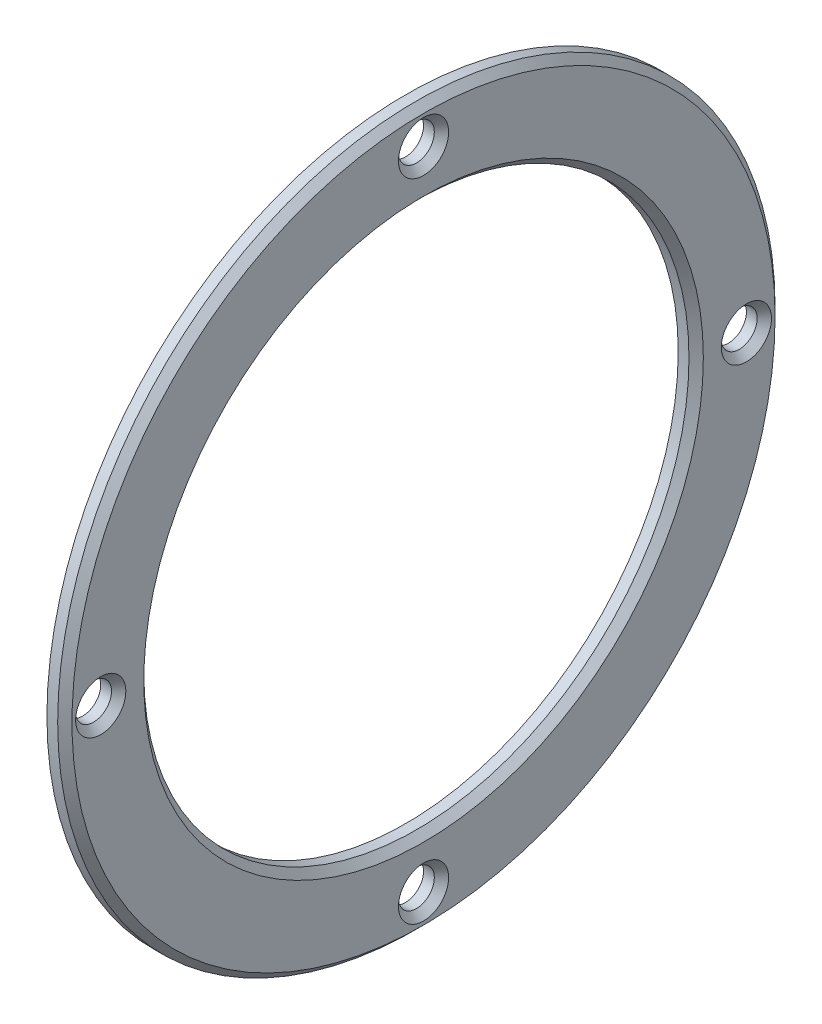
ISO-10303-21;
HEADER;
FILE_DESCRIPTION(('STEP AP214'),'2;1');
FILE_NAME('part.step','',(''),(''),'','','');
FILE_SCHEMA(('AUTOMOTIVE_DESIGN { 1 0 10303 214 1 1 1 1 }'));
ENDSEC;
DATA;
#1=APPLICATION_CONTEXT('core data for automotive mechanical design processes');
#2=APPLICATION_PROTOCOL_DEFINITION('international standard','automotive_design',2000,#1);
#3=PRODUCT_CONTEXT('',#1,'mechanical');
#4=PRODUCT('Part','Part','',(#3));
#5=PRODUCT_RELATED_PRODUCT_CATEGORY('part','',(#4));
#6=PRODUCT_DEFINITION_FORMATION('','',#4);
#7=PRODUCT_DEFINITION_CONTEXT('part definition',#1,'design');
#8=PRODUCT_DEFINITION('design','',#6,#7);
#9=PRODUCT_DEFINITION_SHAPE('','',#8);
#10=(LENGTH_UNIT() NAMED_UNIT(*) SI_UNIT(.MILLI.,.METRE.));
#11=(NAMED_UNIT(*) PLANE_ANGLE_UNIT() SI_UNIT($,.RADIAN.));
#12=(NAMED_UNIT(*) SI_UNIT($,.STERADIAN.) SOLID_ANGLE_UNIT());
#13=UNCERTAINTY_MEASURE_WITH_UNIT(LENGTH_MEASURE(1.E-05),#10,'distance_accuracy_value','');
#14=(GEOMETRIC_REPRESENTATION_CONTEXT(3) GLOBAL_UNCERTAINTY_ASSIGNED_CONTEXT((#13)) GLOBAL_UNIT_ASSIGNED_CONTEXT((#10,
#11,#12)) REPRESENTATION_CONTEXT('',''));
#15=CARTESIAN_POINT('',(0.,0.,0.));
#16=DIRECTION('',(0.,0.,1.));
#17=DIRECTION('',(1.,0.,0.));
#18=AXIS2_PLACEMENT_3D('',#15,#16,#17);
#19=CARTESIAN_POINT('',(2.5,0.,0.));
#20=DIRECTION('',(1.,0.,0.));
#21=DIRECTION('',(0.,0.,-1.));
#22=AXIS2_PLACEMENT_3D('',#19,#20,#21);
#23=PLANE('',#22);
#24=CARTESIAN_POINT('',(2.5,0.,45.));
#25=DIRECTION('',(1.,0.,0.));
#26=DIRECTION('',(0.,0.,-1.));
#27=AXIS2_PLACEMENT_3D('',#24,#25,#26);
#28=CIRCLE('',#27,3.50000000000002);
#29=CARTESIAN_POINT('',(2.5,0.,41.5));
#30=VERTEX_POINT('',#29);
#31=EDGE_CURVE('E74',#30,#30,#28,.F.);
#32=ORIENTED_EDGE('',*,*,#31,.T.);
#33=EDGE_LOOP('',(#32));
#34=FACE_BOUND('',#33,.T.);
#35=CARTESIAN_POINT('',(2.5,0.,-45.));
#36=DIRECTION('',(1.,0.,0.));
#37=DIRECTION('',(0.,0.,-1.));
#38=AXIS2_PLACEMENT_3D('',#35,#36,#37);
#39=CIRCLE('',#38,3.50000000000002);
#40=CARTESIAN_POINT('',(2.5,0.,-48.5));
#41=VERTEX_POINT('',#40);
#42=EDGE_CURVE('E78',#41,#41,#39,.F.);
#43=ORIENTED_EDGE('',*,*,#42,.T.);
#44=EDGE_LOOP('',(#43));
#45=FACE_BOUND('',#44,.T.);
#46=CARTESIAN_POINT('',(2.5,0.,0.));
#47=DIRECTION('',(1.,0.,0.));
#48=DIRECTION('',(0.,0.,-1.));
#49=AXIS2_PLACEMENT_3D('',#46,#47,#48);
#50=CIRCLE('',#49,39.);
#51=CARTESIAN_POINT('',(2.5,0.,-39.));
#52=VERTEX_POINT('',#51);
#53=EDGE_CURVE('E82',#52,#52,#50,.F.);
#54=ORIENTED_EDGE('',*,*,#53,.T.);
#55=EDGE_LOOP('',(#54));
#56=FACE_BOUND('',#55,.T.);
#57=CARTESIAN_POINT('',(2.5,0.,0.));
#58=DIRECTION('',(1.,0.,0.));
#59=DIRECTION('',(0.,0.,-1.));
#60=AXIS2_PLACEMENT_3D('',#57,#58,#59);
#61=CIRCLE('',#60,49.);
#62=CARTESIAN_POINT('',(2.5,0.,-49.));
#63=VERTEX_POINT('',#62);
#64=EDGE_CURVE('E86',#63,#63,#61,.T.);
#65=ORIENTED_EDGE('',*,*,#64,.T.);
#66=EDGE_LOOP('',(#65));
#67=FACE_BOUND('',#66,.T.);
#68=CARTESIAN_POINT('',(2.5,45.,0.));
#69=DIRECTION('',(1.,0.,0.));
#70=DIRECTION('',(0.,0.,-1.));
#71=AXIS2_PLACEMENT_3D('',#68,#69,#70);
#72=CIRCLE('',#71,3.50000000000002);
#73=CARTESIAN_POINT('',(2.5,45.,-3.50000000000002));
#74=VERTEX_POINT('',#73);
#75=EDGE_CURVE('E90',#74,#74,#72,.F.);
#76=ORIENTED_EDGE('',*,*,#75,.T.);
#77=EDGE_LOOP('',(#76));
#78=FACE_BOUND('',#77,.T.);
#79=CARTESIAN_POINT('',(2.5,-45.,0.));
#80=DIRECTION('',(1.,0.,0.));
#81=DIRECTION('',(0.,0.,-1.));
#82=AXIS2_PLACEMENT_3D('',#79,#80,#81);
#83=CIRCLE('',#82,3.50000000000002);
#84=CARTESIAN_POINT('',(2.5,-45.,-3.50000000000002));
#85=VERTEX_POINT('',#84);
#86=EDGE_CURVE('E94',#85,#85,#83,.F.);
#87=ORIENTED_EDGE('',*,*,#86,.T.);
#88=EDGE_LOOP('',(#87));
#89=FACE_BOUND('',#88,.T.);
#90=ADVANCED_FACE('F45',(#34,#45,#56,#67,#78,#89),#23,.T.);
#91=CARTESIAN_POINT('',(0.,0.,0.));
#92=DIRECTION('',(1.,0.,0.));
#93=DIRECTION('',(0.,0.,-1.));
#94=AXIS2_PLACEMENT_3D('',#91,#92,#93);
#95=PLANE('',#94);
#96=CARTESIAN_POINT('',(0.,0.,0.));
#97=DIRECTION('',(1.,0.,0.));
#98=DIRECTION('',(0.,0.,-1.));
#99=AXIS2_PLACEMENT_3D('',#96,#97,#98);
#100=CIRCLE('',#99,50.);
#101=CARTESIAN_POINT('',(0.,0.,-50.));
#102=VERTEX_POINT('',#101);
#103=EDGE_CURVE('E102',#102,#102,#100,.T.);
#104=ORIENTED_EDGE('',*,*,#103,.F.);
#105=EDGE_LOOP('',(#104));
#106=FACE_BOUND('',#105,.T.);
#107=CARTESIAN_POINT('',(0.,0.,0.));
#108=DIRECTION('',(1.,0.,0.));
#109=DIRECTION('',(0.,0.,-1.));
#110=AXIS2_PLACEMENT_3D('',#107,#108,#109);
#111=CIRCLE('',#110,38.);
#112=CARTESIAN_POINT('',(0.,0.,-38.));
#113=VERTEX_POINT('',#112);
#114=EDGE_CURVE('E106',#113,#113,#111,.T.);
#115=ORIENTED_EDGE('',*,*,#114,.T.);
#116=EDGE_LOOP('',(#115));
#117=FACE_BOUND('',#116,.T.);
#118=CARTESIAN_POINT('',(0.,45.,0.));
#119=DIRECTION('',(1.,0.,0.));
#120=DIRECTION('',(0.,0.,-1.));
#121=AXIS2_PLACEMENT_3D('',#118,#119,#120);
#122=CIRCLE('',#121,2.5);
#123=CARTESIAN_POINT('',(0.,45.,-2.5));
#124=VERTEX_POINT('',#123);
#125=EDGE_CURVE('E110',#124,#124,#122,.T.);
#126=ORIENTED_EDGE('',*,*,#125,.T.);
#127=EDGE_LOOP('',(#126));
#128=FACE_BOUND('',#127,.T.);
#129=CARTESIAN_POINT('',(0.,0.,-45.));
#130=DIRECTION('',(1.,0.,0.));
#131=DIRECTION('',(0.,0.,-1.));
#132=AXIS2_PLACEMENT_3D('',#129,#130,#131);
#133=CIRCLE('',#132,2.5);
#134=CARTESIAN_POINT('',(0.,0.,-47.5));
#135=VERTEX_POINT('',#134);
#136=EDGE_CURVE('E114',#135,#135,#133,.T.);
#137=ORIENTED_EDGE('',*,*,#136,.T.);
#138=EDGE_LOOP('',(#137));
#139=FACE_BOUND('',#138,.T.);
#140=CARTESIAN_POINT('',(0.,-45.,0.));
#141=DIRECTION('',(1.,0.,0.));
#142=DIRECTION('',(0.,0.,-1.));
#143=AXIS2_PLACEMENT_3D('',#140,#141,#142);
#144=CIRCLE('',#143,2.5);
#145=CARTESIAN_POINT('',(0.,-45.,-2.50000000000001));
#146=VERTEX_POINT('',#145);
#147=EDGE_CURVE('E118',#146,#146,#144,.T.);
#148=ORIENTED_EDGE('',*,*,#147,.T.);
#149=EDGE_LOOP('',(#148));
#150=FACE_BOUND('',#149,.T.);
#151=CARTESIAN_POINT('',(0.,0.,45.));
#152=DIRECTION('',(1.,0.,0.));
#153=DIRECTION('',(0.,0.,-1.));
#154=AXIS2_PLACEMENT_3D('',#151,#152,#153);
#155=CIRCLE('',#154,2.5);
#156=CARTESIAN_POINT('',(0.,0.,42.5));
#157=VERTEX_POINT('',#156);
#158=EDGE_CURVE('E122',#157,#157,#155,.T.);
#159=ORIENTED_EDGE('',*,*,#158,.T.);
#160=EDGE_LOOP('',(#159));
#161=FACE_BOUND('',#160,.T.);
#162=ADVANCED_FACE('F127',(#106,#117,#128,#139,#150,#161),#95,.F.);
#163=CARTESIAN_POINT('',(2.5,0.,0.));
#164=DIRECTION('',(-1.,0.,0.));
#165=DIRECTION('',(0.,0.,1.));
#166=AXIS2_PLACEMENT_3D('',#163,#164,#165);
#167=CYLINDRICAL_SURFACE('',#166,50.);
#168=CARTESIAN_POINT('',(1.50000000000001,0.,0.));
#169=DIRECTION('',(1.,0.,0.));
#170=DIRECTION('',(0.,0.,-1.));
#171=AXIS2_PLACEMENT_3D('',#168,#169,#170);
#172=CIRCLE('',#171,50.);
#173=CARTESIAN_POINT('',(1.50000000000001,0.,-50.));
#174=VERTEX_POINT('',#173);
#175=EDGE_CURVE('E59',#174,#174,#172,.F.);
#176=ORIENTED_EDGE('',*,*,#175,.T.);
#177=EDGE_LOOP('',(#176));
#178=FACE_BOUND('',#177,.T.);
#179=ORIENTED_EDGE('',*,*,#103,.T.);
#180=EDGE_LOOP('',(#179));
#181=FACE_BOUND('',#180,.T.);
#182=ADVANCED_FACE('F151',(#178,#181),#167,.T.);
#183=CARTESIAN_POINT('',(2.5,0.,0.));
#184=DIRECTION('',(-1.,0.,0.));
#185=DIRECTION('',(0.,0.,1.));
#186=AXIS2_PLACEMENT_3D('',#183,#184,#185);
#187=CYLINDRICAL_SURFACE('',#186,38.);
#188=CARTESIAN_POINT('',(1.49999999999999,0.,0.));
#189=DIRECTION('',(1.,0.,0.));
#190=DIRECTION('',(0.,0.,-1.));
#191=AXIS2_PLACEMENT_3D('',#188,#189,#190);
#192=CIRCLE('',#191,38.);
#193=CARTESIAN_POINT('',(1.49999999999999,0.,-38.));
#194=VERTEX_POINT('',#193);
#195=EDGE_CURVE('E64',#194,#194,#192,.T.);
#196=ORIENTED_EDGE('',*,*,#195,.T.);
#197=EDGE_LOOP('',(#196));
#198=FACE_BOUND('',#197,.T.);
#199=ORIENTED_EDGE('',*,*,#114,.F.);
#200=EDGE_LOOP('',(#199));
#201=FACE_BOUND('',#200,.T.);
#202=ADVANCED_FACE('F156',(#198,#201),#187,.F.);
#203=CARTESIAN_POINT('',(2.5,45.,0.));
#204=DIRECTION('',(-1.,0.,0.));
#205=DIRECTION('',(0.,0.,1.));
#206=AXIS2_PLACEMENT_3D('',#203,#204,#205);
#207=CYLINDRICAL_SURFACE('',#206,2.5);
#208=CARTESIAN_POINT('',(1.49999999999999,45.,0.));
#209=DIRECTION('',(1.,0.,0.));
#210=DIRECTION('',(0.,0.,-1.));
#211=AXIS2_PLACEMENT_3D('',#208,#209,#210);
#212=CIRCLE('',#211,2.5);
#213=CARTESIAN_POINT('',(1.49999999999999,45.,-2.5));
#214=VERTEX_POINT('',#213);
#215=EDGE_CURVE('E54',#214,#214,#212,.T.);
#216=ORIENTED_EDGE('',*,*,#215,.T.);
#217=EDGE_LOOP('',(#216));
#218=FACE_BOUND('',#217,.T.);
#219=ORIENTED_EDGE('',*,*,#125,.F.);
#220=EDGE_LOOP('',(#219));
#221=FACE_BOUND('',#220,.T.);
#222=ADVANCED_FACE('F249',(#218,#221),#207,.F.);
#223=CARTESIAN_POINT('',(2.5,0.,-45.));
#224=DIRECTION('',(-1.,0.,0.));
#225=DIRECTION('',(0.,0.,1.));
#226=AXIS2_PLACEMENT_3D('',#223,#224,#225);
#227=CYLINDRICAL_SURFACE('',#226,2.5);
#228=CARTESIAN_POINT('',(1.49999999999999,0.,-45.));
#229=DIRECTION('',(1.,0.,0.));
#230=DIRECTION('',(0.,0.,-1.));
#231=AXIS2_PLACEMENT_3D('',#228,#229,#230);
#232=CIRCLE('',#231,2.5);
#233=CARTESIAN_POINT('',(1.49999999999999,0.,-47.5));
#234=VERTEX_POINT('',#233);
#235=EDGE_CURVE('E70',#234,#234,#232,.T.);
#236=ORIENTED_EDGE('',*,*,#235,.T.);
#237=EDGE_LOOP('',(#236));
#238=FACE_BOUND('',#237,.T.);
#239=ORIENTED_EDGE('',*,*,#136,.F.);
#240=EDGE_LOOP('',(#239));
#241=FACE_BOUND('',#240,.T.);
#242=ADVANCED_FACE('F142',(#238,#241),#227,.F.);
#243=CARTESIAN_POINT('',(2.5,-45.,0.));
#244=DIRECTION('',(-1.,0.,0.));
#245=DIRECTION('',(0.,0.,1.));
#246=AXIS2_PLACEMENT_3D('',#243,#244,#245);
#247=CYLINDRICAL_SURFACE('',#246,2.5);
#248=CARTESIAN_POINT('',(1.49999999999999,-45.,0.));
#249=DIRECTION('',(1.,0.,0.));
#250=DIRECTION('',(0.,0.,-1.));
#251=AXIS2_PLACEMENT_3D('',#248,#249,#250);
#252=CIRCLE('',#251,2.5);
#253=CARTESIAN_POINT('',(1.49999999999999,-45.,-2.50000000000001));
#254=VERTEX_POINT('',#253);
#255=EDGE_CURVE('E10',#254,#254,#252,.T.);
#256=ORIENTED_EDGE('',*,*,#255,.T.);
#257=EDGE_LOOP('',(#256));
#258=FACE_BOUND('',#257,.T.);
#259=ORIENTED_EDGE('',*,*,#147,.F.);
#260=EDGE_LOOP('',(#259));
#261=FACE_BOUND('',#260,.T.);
#262=ADVANCED_FACE('F132',(#258,#261),#247,.F.);
#263=CARTESIAN_POINT('',(2.5,0.,45.));
#264=DIRECTION('',(-1.,0.,0.));
#265=DIRECTION('',(0.,0.,1.));
#266=AXIS2_PLACEMENT_3D('',#263,#264,#265);
#267=CYLINDRICAL_SURFACE('',#266,2.5);
#268=CARTESIAN_POINT('',(1.49999999999999,0.,45.));
#269=DIRECTION('',(1.,0.,0.));
#270=DIRECTION('',(0.,0.,-1.));
#271=AXIS2_PLACEMENT_3D('',#268,#269,#270);
#272=CIRCLE('',#271,2.5);
#273=CARTESIAN_POINT('',(1.49999999999999,0.,42.5));
#274=VERTEX_POINT('',#273);
#275=EDGE_CURVE('E98',#274,#274,#272,.T.);
#276=ORIENTED_EDGE('',*,*,#275,.T.);
#277=EDGE_LOOP('',(#276));
#278=FACE_BOUND('',#277,.T.);
#279=ORIENTED_EDGE('',*,*,#158,.F.);
#280=EDGE_LOOP('',(#279));
#281=FACE_BOUND('',#280,.T.);
#282=ADVANCED_FACE('F129',(#278,#281),#267,.F.);
#283=CARTESIAN_POINT('',(1.49999999999999,0.,45.));
#284=DIRECTION('',(1.,0.,0.));
#285=DIRECTION('',(0.,0.,-1.));
#286=AXIS2_PLACEMENT_3D('',#283,#284,#285);
#287=CONICAL_SURFACE('',#286,2.5,0.785398163397451);
#288=ORIENTED_EDGE('',*,*,#31,.F.);
#289=EDGE_LOOP('',(#288));
#290=FACE_BOUND('',#289,.T.);
#291=ORIENTED_EDGE('',*,*,#275,.F.);
#292=EDGE_LOOP('',(#291));
#293=FACE_BOUND('',#292,.T.);
#294=ADVANCED_FACE('F131',(#290,#293),#287,.F.);
#295=CARTESIAN_POINT('',(1.49999999999999,0.,-45.));
#296=DIRECTION('',(1.,0.,0.));
#297=DIRECTION('',(0.,0.,-1.));
#298=AXIS2_PLACEMENT_3D('',#295,#296,#297);
#299=CONICAL_SURFACE('',#298,2.5,0.785398163397451);
#300=ORIENTED_EDGE('',*,*,#42,.F.);
#301=EDGE_LOOP('',(#300));
#302=FACE_BOUND('',#301,.T.);
#303=ORIENTED_EDGE('',*,*,#235,.F.);
#304=EDGE_LOOP('',(#303));
#305=FACE_BOUND('',#304,.T.);
#306=ADVANCED_FACE('F139',(#302,#305),#299,.F.);
#307=CARTESIAN_POINT('',(1.49999999999999,0.,0.));
#308=DIRECTION('',(1.,0.,0.));
#309=DIRECTION('',(0.,0.,-1.));
#310=AXIS2_PLACEMENT_3D('',#307,#308,#309);
#311=CONICAL_SURFACE('',#310,38.,0.785398163397445);
#312=ORIENTED_EDGE('',*,*,#53,.F.);
#313=EDGE_LOOP('',(#312));
#314=FACE_BOUND('',#313,.T.);
#315=ORIENTED_EDGE('',*,*,#195,.F.);
#316=EDGE_LOOP('',(#315));
#317=FACE_BOUND('',#316,.T.);
#318=ADVANCED_FACE('F170',(#314,#317),#311,.F.);
#319=CARTESIAN_POINT('',(2.5,0.,0.));
#320=DIRECTION('',(-1.,0.,0.));
#321=DIRECTION('',(0.,0.,1.));
#322=AXIS2_PLACEMENT_3D('',#319,#320,#321);
#323=CONICAL_SURFACE('',#322,49.,0.785398163397445);
#324=ORIENTED_EDGE('',*,*,#175,.F.);
#325=EDGE_LOOP('',(#324));
#326=FACE_BOUND('',#325,.T.);
#327=ORIENTED_EDGE('',*,*,#64,.F.);
#328=EDGE_LOOP('',(#327));
#329=FACE_BOUND('',#328,.T.);
#330=ADVANCED_FACE('F177',(#326,#329),#323,.T.);
#331=CARTESIAN_POINT('',(1.49999999999999,45.,0.));
#332=DIRECTION('',(1.,0.,0.));
#333=DIRECTION('',(0.,0.,-1.));
#334=AXIS2_PLACEMENT_3D('',#331,#332,#333);
#335=CONICAL_SURFACE('',#334,2.5,0.785398163397451);
#336=ORIENTED_EDGE('',*,*,#75,.F.);
#337=EDGE_LOOP('',(#336));
#338=FACE_BOUND('',#337,.T.);
#339=ORIENTED_EDGE('',*,*,#215,.F.);
#340=EDGE_LOOP('',(#339));
#341=FACE_BOUND('',#340,.T.);
#342=ADVANCED_FACE('F183',(#338,#341),#335,.F.);
#343=CARTESIAN_POINT('',(1.49999999999999,-45.,0.));
#344=DIRECTION('',(1.,0.,0.));
#345=DIRECTION('',(0.,0.,-1.));
#346=AXIS2_PLACEMENT_3D('',#343,#344,#345);
#347=CONICAL_SURFACE('',#346,2.5,0.785398163397451);
#348=ORIENTED_EDGE('',*,*,#86,.F.);
#349=EDGE_LOOP('',(#348));
#350=FACE_BOUND('',#349,.T.);
#351=ORIENTED_EDGE('',*,*,#255,.F.);
#352=EDGE_LOOP('',(#351));
#353=FACE_BOUND('',#352,.T.);
#354=ADVANCED_FACE('F48',(#350,#353),#347,.F.);
#355=CLOSED_SHELL('',(#90,#162,#182,#202,#222,#242,#262,#282,#294,#306,#318,#330,#342,#354));
#356=MANIFOLD_SOLID_BREP('B2',#355);
#357=ADVANCED_BREP_SHAPE_REPRESENTATION('',(#18,#356),#14);
#358=SHAPE_DEFINITION_REPRESENTATION(#9,#357);
ENDSEC;
END-ISO-10303-21;
